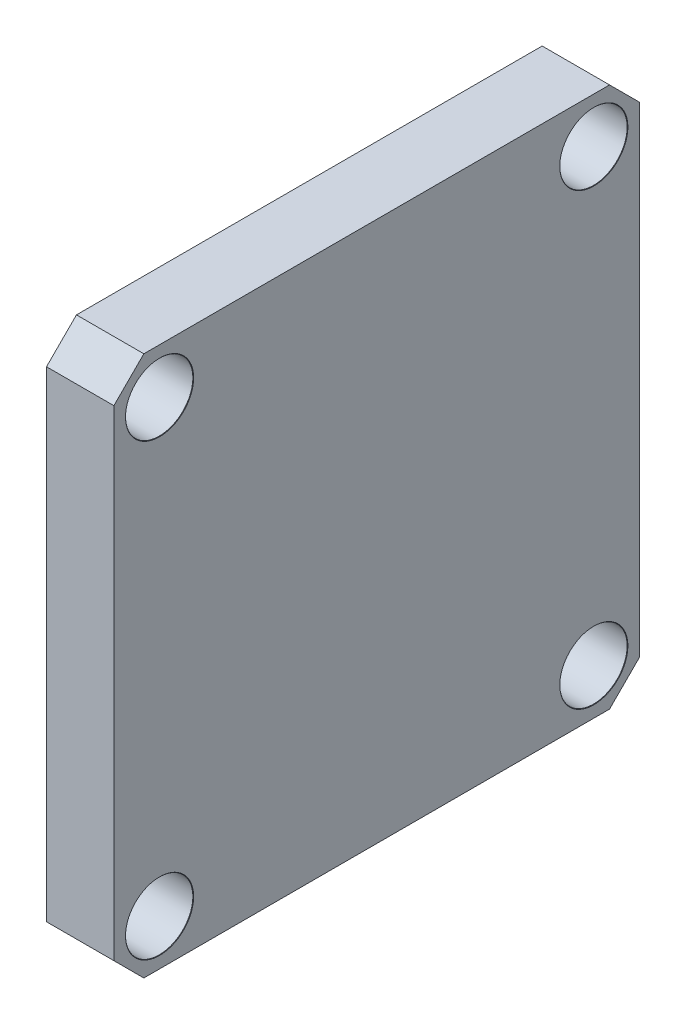
ISO-10303-21;
HEADER;
FILE_DESCRIPTION(('STEP AP214'),'2;1');
FILE_NAME('part.step','',(''),(''),'','','');
FILE_SCHEMA(('AUTOMOTIVE_DESIGN { 1 0 10303 214 1 1 1 1 }'));
ENDSEC;
DATA;
#1=APPLICATION_CONTEXT('core data for automotive mechanical design processes');
#2=APPLICATION_PROTOCOL_DEFINITION('international standard','automotive_design',2000,#1);
#3=PRODUCT_CONTEXT('',#1,'mechanical');
#4=PRODUCT('Part','Part','',(#3));
#5=PRODUCT_RELATED_PRODUCT_CATEGORY('part','',(#4));
#6=PRODUCT_DEFINITION_FORMATION('','',#4);
#7=PRODUCT_DEFINITION_CONTEXT('part definition',#1,'design');
#8=PRODUCT_DEFINITION('design','',#6,#7);
#9=PRODUCT_DEFINITION_SHAPE('','',#8);
#10=(LENGTH_UNIT() NAMED_UNIT(*) SI_UNIT(.MILLI.,.METRE.));
#11=(NAMED_UNIT(*) PLANE_ANGLE_UNIT() SI_UNIT($,.RADIAN.));
#12=(NAMED_UNIT(*) SI_UNIT($,.STERADIAN.) SOLID_ANGLE_UNIT());
#13=UNCERTAINTY_MEASURE_WITH_UNIT(LENGTH_MEASURE(1.E-05),#10,'distance_accuracy_value','');
#14=(GEOMETRIC_REPRESENTATION_CONTEXT(3) GLOBAL_UNCERTAINTY_ASSIGNED_CONTEXT((#13)) GLOBAL_UNIT_ASSIGNED_CONTEXT((#10,
#11,#12)) REPRESENTATION_CONTEXT('',''));
#15=CARTESIAN_POINT('',(0.,0.,0.));
#16=DIRECTION('',(0.,0.,1.));
#17=DIRECTION('',(1.,0.,0.));
#18=AXIS2_PLACEMENT_3D('',#15,#16,#17);
#19=CARTESIAN_POINT('',(4.5,-18.05,-17.55));
#20=DIRECTION('',(0.,0.,1.));
#21=DIRECTION('',(1.,0.,0.));
#22=AXIS2_PLACEMENT_3D('',#19,#20,#21);
#23=PLANE('',#22);
#24=DIRECTION('',(0.,1.,0.));
#25=VECTOR('',#24,1.);
#26=CARTESIAN_POINT('',(4.5,-18.05,-17.55));
#27=LINE('',#26,#25);
#28=CARTESIAN_POINT('',(4.5,-16.05,-17.55));
#29=VERTEX_POINT('',#28);
#30=CARTESIAN_POINT('',(4.5,16.05,-17.55));
#31=VERTEX_POINT('',#30);
#32=EDGE_CURVE('E117',#29,#31,#27,.T.);
#33=ORIENTED_EDGE('',*,*,#32,.F.);
#34=DIRECTION('',(-1.,0.,0.));
#35=VECTOR('',#34,1.);
#36=CARTESIAN_POINT('',(4.5,-16.05,-17.55));
#37=LINE('',#36,#35);
#38=CARTESIAN_POINT('',(0.,-16.05,-17.55));
#39=VERTEX_POINT('',#38);
#40=EDGE_CURVE('E102',#29,#39,#37,.T.);
#41=ORIENTED_EDGE('',*,*,#40,.T.);
#42=DIRECTION('',(0.,1.,0.));
#43=VECTOR('',#42,1.);
#44=CARTESIAN_POINT('',(0.,-18.05,-17.55));
#45=LINE('',#44,#43);
#46=CARTESIAN_POINT('',(0.,16.05,-17.55));
#47=VERTEX_POINT('',#46);
#48=EDGE_CURVE('E114',#39,#47,#45,.T.);
#49=ORIENTED_EDGE('',*,*,#48,.T.);
#50=DIRECTION('',(1.,0.,0.));
#51=VECTOR('',#50,1.);
#52=CARTESIAN_POINT('',(4.5,16.05,-17.55));
#53=LINE('',#52,#51);
#54=EDGE_CURVE('E119',#47,#31,#53,.T.);
#55=ORIENTED_EDGE('',*,*,#54,.T.);
#56=EDGE_LOOP('',(#33,#41,#49,#55));
#57=FACE_BOUND('',#56,.T.);
#58=ADVANCED_FACE('F33',(#57),#23,.F.);
#59=CARTESIAN_POINT('',(4.5,18.05,17.55));
#60=DIRECTION('',(0.,-1.,0.));
#61=DIRECTION('',(0.,0.,-1.));
#62=AXIS2_PLACEMENT_3D('',#59,#60,#61);
#63=PLANE('',#62);
#64=DIRECTION('',(0.,0.,1.));
#65=VECTOR('',#64,1.);
#66=CARTESIAN_POINT('',(4.5,18.05,17.55));
#67=LINE('',#66,#65);
#68=CARTESIAN_POINT('',(4.5,18.05,-15.55));
#69=VERTEX_POINT('',#68);
#70=CARTESIAN_POINT('',(4.5,18.05,15.55));
#71=VERTEX_POINT('',#70);
#72=EDGE_CURVE('E172',#69,#71,#67,.T.);
#73=ORIENTED_EDGE('',*,*,#72,.F.);
#74=DIRECTION('',(-1.,0.,0.));
#75=VECTOR('',#74,1.);
#76=CARTESIAN_POINT('',(4.5,18.05,-15.55));
#77=LINE('',#76,#75);
#78=CARTESIAN_POINT('',(0.,18.05,-15.55));
#79=VERTEX_POINT('',#78);
#80=EDGE_CURVE('E156',#69,#79,#77,.T.);
#81=ORIENTED_EDGE('',*,*,#80,.T.);
#82=DIRECTION('',(0.,0.,1.));
#83=VECTOR('',#82,1.);
#84=CARTESIAN_POINT('',(0.,18.05,17.55));
#85=LINE('',#84,#83);
#86=CARTESIAN_POINT('',(0.,18.05,15.55));
#87=VERTEX_POINT('',#86);
#88=EDGE_CURVE('E123',#79,#87,#85,.T.);
#89=ORIENTED_EDGE('',*,*,#88,.T.);
#90=DIRECTION('',(1.,0.,0.));
#91=VECTOR('',#90,1.);
#92=CARTESIAN_POINT('',(4.5,18.05,15.55));
#93=LINE('',#92,#91);
#94=EDGE_CURVE('E154',#87,#71,#93,.T.);
#95=ORIENTED_EDGE('',*,*,#94,.T.);
#96=EDGE_LOOP('',(#73,#81,#89,#95));
#97=FACE_BOUND('',#96,.T.);
#98=ADVANCED_FACE('F238',(#97),#63,.F.);
#99=CARTESIAN_POINT('',(4.5,-18.05,17.55));
#100=DIRECTION('',(0.,0.,-1.));
#101=DIRECTION('',(-1.,0.,0.));
#102=AXIS2_PLACEMENT_3D('',#99,#100,#101);
#103=PLANE('',#102);
#104=DIRECTION('',(0.,-1.,0.));
#105=VECTOR('',#104,1.);
#106=CARTESIAN_POINT('',(0.,-18.05,17.55));
#107=LINE('',#106,#105);
#108=CARTESIAN_POINT('',(0.,16.05,17.55));
#109=VERTEX_POINT('',#108);
#110=CARTESIAN_POINT('',(0.,-16.05,17.55));
#111=VERTEX_POINT('',#110);
#112=EDGE_CURVE('E127',#109,#111,#107,.T.);
#113=ORIENTED_EDGE('',*,*,#112,.T.);
#114=DIRECTION('',(1.,0.,0.));
#115=VECTOR('',#114,1.);
#116=CARTESIAN_POINT('',(4.5,-16.05,17.55));
#117=LINE('',#116,#115);
#118=CARTESIAN_POINT('',(4.5,-16.05,17.55));
#119=VERTEX_POINT('',#118);
#120=EDGE_CURVE('E11',#111,#119,#117,.T.);
#121=ORIENTED_EDGE('',*,*,#120,.T.);
#122=DIRECTION('',(0.,-1.,0.));
#123=VECTOR('',#122,1.);
#124=CARTESIAN_POINT('',(4.5,-18.05,17.55));
#125=LINE('',#124,#123);
#126=CARTESIAN_POINT('',(4.5,16.05,17.55));
#127=VERTEX_POINT('',#126);
#128=EDGE_CURVE('E162',#127,#119,#125,.T.);
#129=ORIENTED_EDGE('',*,*,#128,.F.);
#130=DIRECTION('',(-1.,0.,0.));
#131=VECTOR('',#130,1.);
#132=CARTESIAN_POINT('',(4.5,16.05,17.55));
#133=LINE('',#132,#131);
#134=EDGE_CURVE('E41',#127,#109,#133,.T.);
#135=ORIENTED_EDGE('',*,*,#134,.T.);
#136=EDGE_LOOP('',(#113,#121,#129,#135));
#137=FACE_BOUND('',#136,.T.);
#138=ADVANCED_FACE('F161',(#137),#103,.F.);
#139=CARTESIAN_POINT('',(4.5,-18.05,17.55));
#140=DIRECTION('',(0.,1.,0.));
#141=DIRECTION('',(0.,0.,1.));
#142=AXIS2_PLACEMENT_3D('',#139,#140,#141);
#143=PLANE('',#142);
#144=DIRECTION('',(0.,0.,-1.));
#145=VECTOR('',#144,1.);
#146=CARTESIAN_POINT('',(0.,-18.05,17.55));
#147=LINE('',#146,#145);
#148=CARTESIAN_POINT('',(0.,-18.05,15.55));
#149=VERTEX_POINT('',#148);
#150=CARTESIAN_POINT('',(0.,-18.05,-15.55));
#151=VERTEX_POINT('',#150);
#152=EDGE_CURVE('E137',#149,#151,#147,.T.);
#153=ORIENTED_EDGE('',*,*,#152,.T.);
#154=DIRECTION('',(1.,0.,0.));
#155=VECTOR('',#154,1.);
#156=CARTESIAN_POINT('',(4.5,-18.05,-15.55));
#157=LINE('',#156,#155);
#158=CARTESIAN_POINT('',(4.5,-18.05,-15.55));
#159=VERTEX_POINT('',#158);
#160=EDGE_CURVE('E103',#151,#159,#157,.T.);
#161=ORIENTED_EDGE('',*,*,#160,.T.);
#162=DIRECTION('',(0.,0.,-1.));
#163=VECTOR('',#162,1.);
#164=CARTESIAN_POINT('',(4.5,-18.05,17.55));
#165=LINE('',#164,#163);
#166=CARTESIAN_POINT('',(4.5,-18.05,15.55));
#167=VERTEX_POINT('',#166);
#168=EDGE_CURVE('E133',#167,#159,#165,.T.);
#169=ORIENTED_EDGE('',*,*,#168,.F.);
#170=DIRECTION('',(-1.,0.,0.));
#171=VECTOR('',#170,1.);
#172=CARTESIAN_POINT('',(4.5,-18.05,15.55));
#173=LINE('',#172,#171);
#174=EDGE_CURVE('E108',#167,#149,#173,.T.);
#175=ORIENTED_EDGE('',*,*,#174,.T.);
#176=EDGE_LOOP('',(#153,#161,#169,#175));
#177=FACE_BOUND('',#176,.T.);
#178=ADVANCED_FACE('F170',(#177),#143,.F.);
#179=CARTESIAN_POINT('',(4.5,0.,0.));
#180=DIRECTION('',(-1.,0.,0.));
#181=DIRECTION('',(0.,0.,1.));
#182=AXIS2_PLACEMENT_3D('',#179,#180,#181);
#183=PLANE('',#182);
#184=CARTESIAN_POINT('',(4.5,15.,-14.5));
#185=DIRECTION('',(1.,0.,0.));
#186=DIRECTION('',(0.,0.,-1.));
#187=AXIS2_PLACEMENT_3D('',#184,#185,#186);
#188=CIRCLE('',#187,2.275);
#189=CARTESIAN_POINT('',(4.5,15.,-16.775));
#190=VERTEX_POINT('',#189);
#191=EDGE_CURVE('E205',#190,#190,#188,.T.);
#192=ORIENTED_EDGE('',*,*,#191,.F.);
#193=EDGE_LOOP('',(#192));
#194=FACE_BOUND('',#193,.T.);
#195=CARTESIAN_POINT('',(4.5,15.,14.5));
#196=DIRECTION('',(1.,0.,0.));
#197=DIRECTION('',(0.,0.,-1.));
#198=AXIS2_PLACEMENT_3D('',#195,#196,#197);
#199=CIRCLE('',#198,2.275);
#200=CARTESIAN_POINT('',(4.5,15.,12.225));
#201=VERTEX_POINT('',#200);
#202=EDGE_CURVE('E196',#201,#201,#199,.T.);
#203=ORIENTED_EDGE('',*,*,#202,.F.);
#204=EDGE_LOOP('',(#203));
#205=FACE_BOUND('',#204,.T.);
#206=CARTESIAN_POINT('',(4.5,-15.,14.5));
#207=DIRECTION('',(1.,0.,0.));
#208=DIRECTION('',(0.,0.,-1.));
#209=AXIS2_PLACEMENT_3D('',#206,#207,#208);
#210=CIRCLE('',#209,2.275);
#211=CARTESIAN_POINT('',(4.5,-15.,12.225));
#212=VERTEX_POINT('',#211);
#213=EDGE_CURVE('E187',#212,#212,#210,.T.);
#214=ORIENTED_EDGE('',*,*,#213,.F.);
#215=EDGE_LOOP('',(#214));
#216=FACE_BOUND('',#215,.T.);
#217=CARTESIAN_POINT('',(4.5,-15.,-14.5));
#218=DIRECTION('',(1.,0.,0.));
#219=DIRECTION('',(0.,0.,-1.));
#220=AXIS2_PLACEMENT_3D('',#217,#218,#219);
#221=CIRCLE('',#220,2.275);
#222=CARTESIAN_POINT('',(4.5,-15.,-16.775));
#223=VERTEX_POINT('',#222);
#224=EDGE_CURVE('E178',#223,#223,#221,.T.);
#225=ORIENTED_EDGE('',*,*,#224,.F.);
#226=EDGE_LOOP('',(#225));
#227=FACE_BOUND('',#226,.T.);
#228=ORIENTED_EDGE('',*,*,#168,.T.);
#229=DIRECTION('',(0.,-0.707106781186546,0.707106781186549));
#230=VECTOR('',#229,1.);
#231=CARTESIAN_POINT('',(4.5,-16.05,-17.55));
#232=LINE('',#231,#230);
#233=EDGE_CURVE('E152',#159,#29,#232,.F.);
#234=ORIENTED_EDGE('',*,*,#233,.T.);
#235=ORIENTED_EDGE('',*,*,#32,.T.);
#236=DIRECTION('',(0.,-0.707106781186549,-0.707106781186546));
#237=VECTOR('',#236,1.);
#238=CARTESIAN_POINT('',(4.5,18.05,-15.55));
#239=LINE('',#238,#237);
#240=EDGE_CURVE('E150',#31,#69,#239,.F.);
#241=ORIENTED_EDGE('',*,*,#240,.T.);
#242=ORIENTED_EDGE('',*,*,#72,.T.);
#243=DIRECTION('',(0.,0.707106781186546,-0.707106781186549));
#244=VECTOR('',#243,1.);
#245=CARTESIAN_POINT('',(4.5,16.05,17.55));
#246=LINE('',#245,#244);
#247=EDGE_CURVE('E53',#71,#127,#246,.F.);
#248=ORIENTED_EDGE('',*,*,#247,.T.);
#249=ORIENTED_EDGE('',*,*,#128,.T.);
#250=DIRECTION('',(0.,0.707106781186549,0.707106781186546));
#251=VECTOR('',#250,1.);
#252=CARTESIAN_POINT('',(4.5,-18.05,15.55));
#253=LINE('',#252,#251);
#254=EDGE_CURVE('E148',#119,#167,#253,.F.);
#255=ORIENTED_EDGE('',*,*,#254,.T.);
#256=EDGE_LOOP('',(#228,#234,#235,#241,#242,#248,#249,#255));
#257=FACE_BOUND('',#256,.T.);
#258=ADVANCED_FACE('F211',(#194,#205,#216,#227,#257),#183,.F.);
#259=CARTESIAN_POINT('',(0.,0.,0.));
#260=DIRECTION('',(-1.,0.,0.));
#261=DIRECTION('',(0.,0.,1.));
#262=AXIS2_PLACEMENT_3D('',#259,#260,#261);
#263=PLANE('',#262);
#264=CARTESIAN_POINT('',(0.,15.,-14.5));
#265=DIRECTION('',(1.,0.,0.));
#266=DIRECTION('',(0.,0.,-1.));
#267=AXIS2_PLACEMENT_3D('',#264,#265,#266);
#268=CIRCLE('',#267,2.25);
#269=CARTESIAN_POINT('',(0.,15.,-16.75));
#270=VERTEX_POINT('',#269);
#271=EDGE_CURVE('E199',#270,#270,#268,.T.);
#272=ORIENTED_EDGE('',*,*,#271,.T.);
#273=EDGE_LOOP('',(#272));
#274=FACE_BOUND('',#273,.T.);
#275=CARTESIAN_POINT('',(0.,15.,14.5));
#276=DIRECTION('',(1.,0.,0.));
#277=DIRECTION('',(0.,0.,-1.));
#278=AXIS2_PLACEMENT_3D('',#275,#276,#277);
#279=CIRCLE('',#278,2.25);
#280=CARTESIAN_POINT('',(0.,15.,12.25));
#281=VERTEX_POINT('',#280);
#282=EDGE_CURVE('E190',#281,#281,#279,.T.);
#283=ORIENTED_EDGE('',*,*,#282,.T.);
#284=EDGE_LOOP('',(#283));
#285=FACE_BOUND('',#284,.T.);
#286=CARTESIAN_POINT('',(0.,-15.,14.5));
#287=DIRECTION('',(1.,0.,0.));
#288=DIRECTION('',(0.,0.,-1.));
#289=AXIS2_PLACEMENT_3D('',#286,#287,#288);
#290=CIRCLE('',#289,2.25);
#291=CARTESIAN_POINT('',(0.,-15.,12.25));
#292=VERTEX_POINT('',#291);
#293=EDGE_CURVE('E181',#292,#292,#290,.T.);
#294=ORIENTED_EDGE('',*,*,#293,.T.);
#295=EDGE_LOOP('',(#294));
#296=FACE_BOUND('',#295,.T.);
#297=CARTESIAN_POINT('',(0.,-15.,-14.5));
#298=DIRECTION('',(1.,0.,0.));
#299=DIRECTION('',(0.,0.,-1.));
#300=AXIS2_PLACEMENT_3D('',#297,#298,#299);
#301=CIRCLE('',#300,2.25);
#302=CARTESIAN_POINT('',(0.,-15.,-16.75));
#303=VERTEX_POINT('',#302);
#304=EDGE_CURVE('E124',#303,#303,#301,.T.);
#305=ORIENTED_EDGE('',*,*,#304,.T.);
#306=EDGE_LOOP('',(#305));
#307=FACE_BOUND('',#306,.T.);
#308=ORIENTED_EDGE('',*,*,#48,.F.);
#309=DIRECTION('',(0.,0.707106781186546,-0.707106781186549));
#310=VECTOR('',#309,1.);
#311=CARTESIAN_POINT('',(0.,-16.8,-16.8));
#312=LINE('',#311,#310);
#313=EDGE_CURVE('E98',#39,#151,#312,.F.);
#314=ORIENTED_EDGE('',*,*,#313,.T.);
#315=ORIENTED_EDGE('',*,*,#152,.F.);
#316=DIRECTION('',(0.,-0.707106781186549,-0.707106781186546));
#317=VECTOR('',#316,1.);
#318=CARTESIAN_POINT('',(0.,-16.8,16.8));
#319=LINE('',#318,#317);
#320=EDGE_CURVE('E141',#149,#111,#319,.F.);
#321=ORIENTED_EDGE('',*,*,#320,.T.);
#322=ORIENTED_EDGE('',*,*,#112,.F.);
#323=DIRECTION('',(0.,-0.707106781186546,0.707106781186549));
#324=VECTOR('',#323,1.);
#325=CARTESIAN_POINT('',(0.,16.8,16.8));
#326=LINE('',#325,#324);
#327=EDGE_CURVE('E118',#109,#87,#326,.F.);
#328=ORIENTED_EDGE('',*,*,#327,.T.);
#329=ORIENTED_EDGE('',*,*,#88,.F.);
#330=DIRECTION('',(0.,0.707106781186549,0.707106781186546));
#331=VECTOR('',#330,1.);
#332=CARTESIAN_POINT('',(0.,16.8,-16.8));
#333=LINE('',#332,#331);
#334=EDGE_CURVE('E109',#79,#47,#333,.F.);
#335=ORIENTED_EDGE('',*,*,#334,.T.);
#336=EDGE_LOOP('',(#308,#314,#315,#321,#322,#328,#329,#335));
#337=FACE_BOUND('',#336,.T.);
#338=ADVANCED_FACE('F121',(#274,#285,#296,#307,#337),#263,.T.);
#339=CARTESIAN_POINT('',(4.5,-16.05,-17.55));
#340=DIRECTION('',(0.,0.707106781186549,0.707106781186546));
#341=DIRECTION('',(-1.,0.,0.));
#342=AXIS2_PLACEMENT_3D('',#339,#340,#341);
#343=PLANE('',#342);
#344=ORIENTED_EDGE('',*,*,#233,.F.);
#345=ORIENTED_EDGE('',*,*,#160,.F.);
#346=ORIENTED_EDGE('',*,*,#313,.F.);
#347=ORIENTED_EDGE('',*,*,#40,.F.);
#348=EDGE_LOOP('',(#344,#345,#346,#347));
#349=FACE_BOUND('',#348,.T.);
#350=ADVANCED_FACE('F101',(#349),#343,.F.);
#351=CARTESIAN_POINT('',(4.5,18.05,-15.55));
#352=DIRECTION('',(0.,-0.707106781186546,0.707106781186549));
#353=DIRECTION('',(-1.,0.,0.));
#354=AXIS2_PLACEMENT_3D('',#351,#352,#353);
#355=PLANE('',#354);
#356=ORIENTED_EDGE('',*,*,#240,.F.);
#357=ORIENTED_EDGE('',*,*,#54,.F.);
#358=ORIENTED_EDGE('',*,*,#334,.F.);
#359=ORIENTED_EDGE('',*,*,#80,.F.);
#360=EDGE_LOOP('',(#356,#357,#358,#359));
#361=FACE_BOUND('',#360,.T.);
#362=ADVANCED_FACE('F249',(#361),#355,.F.);
#363=CARTESIAN_POINT('',(4.5,-18.05,15.55));
#364=DIRECTION('',(0.,0.707106781186546,-0.707106781186549));
#365=DIRECTION('',(-1.,0.,0.));
#366=AXIS2_PLACEMENT_3D('',#363,#364,#365);
#367=PLANE('',#366);
#368=ORIENTED_EDGE('',*,*,#254,.F.);
#369=ORIENTED_EDGE('',*,*,#120,.F.);
#370=ORIENTED_EDGE('',*,*,#320,.F.);
#371=ORIENTED_EDGE('',*,*,#174,.F.);
#372=EDGE_LOOP('',(#368,#369,#370,#371));
#373=FACE_BOUND('',#372,.T.);
#374=ADVANCED_FACE('F167',(#373),#367,.F.);
#375=CARTESIAN_POINT('',(4.5,16.05,17.55));
#376=DIRECTION('',(0.,-0.707106781186549,-0.707106781186546));
#377=DIRECTION('',(-1.,0.,0.));
#378=AXIS2_PLACEMENT_3D('',#375,#376,#377);
#379=PLANE('',#378);
#380=ORIENTED_EDGE('',*,*,#247,.F.);
#381=ORIENTED_EDGE('',*,*,#94,.F.);
#382=ORIENTED_EDGE('',*,*,#327,.F.);
#383=ORIENTED_EDGE('',*,*,#134,.F.);
#384=EDGE_LOOP('',(#380,#381,#382,#383));
#385=FACE_BOUND('',#384,.T.);
#386=ADVANCED_FACE('F35',(#385),#379,.F.);
#387=CARTESIAN_POINT('',(4.5,-15.,-14.5));
#388=DIRECTION('',(1.,0.,0.));
#389=DIRECTION('',(0.,0.,-1.));
#390=AXIS2_PLACEMENT_3D('',#387,#388,#389);
#391=CYLINDRICAL_SURFACE('',#390,2.25);
#392=ORIENTED_EDGE('',*,*,#304,.F.);
#393=EDGE_LOOP('',(#392));
#394=FACE_BOUND('',#393,.T.);
#395=CARTESIAN_POINT('',(4.475,-15.,-14.5));
#396=DIRECTION('',(1.,0.,0.));
#397=DIRECTION('',(0.,0.,-1.));
#398=AXIS2_PLACEMENT_3D('',#395,#396,#397);
#399=CIRCLE('',#398,2.25);
#400=CARTESIAN_POINT('',(4.475,-15.,-16.75));
#401=VERTEX_POINT('',#400);
#402=EDGE_CURVE('E130',#401,#401,#399,.T.);
#403=ORIENTED_EDGE('',*,*,#402,.T.);
#404=EDGE_LOOP('',(#403));
#405=FACE_BOUND('',#404,.T.);
#406=ADVANCED_FACE('F224',(#394,#405),#391,.F.);
#407=CARTESIAN_POINT('',(4.5,-15.,-14.5));
#408=DIRECTION('',(1.,0.,0.));
#409=DIRECTION('',(0.,0.,-1.));
#410=AXIS2_PLACEMENT_3D('',#407,#408,#409);
#411=CONICAL_SURFACE('',#410,2.275,0.785398163397414);
#412=ORIENTED_EDGE('',*,*,#402,.F.);
#413=EDGE_LOOP('',(#412));
#414=FACE_BOUND('',#413,.T.);
#415=ORIENTED_EDGE('',*,*,#224,.T.);
#416=EDGE_LOOP('',(#415));
#417=FACE_BOUND('',#416,.T.);
#418=ADVANCED_FACE('F221',(#414,#417),#411,.F.);
#419=CARTESIAN_POINT('',(4.5,-15.,14.5));
#420=DIRECTION('',(1.,0.,0.));
#421=DIRECTION('',(0.,0.,-1.));
#422=AXIS2_PLACEMENT_3D('',#419,#420,#421);
#423=CYLINDRICAL_SURFACE('',#422,2.25);
#424=ORIENTED_EDGE('',*,*,#293,.F.);
#425=EDGE_LOOP('',(#424));
#426=FACE_BOUND('',#425,.T.);
#427=CARTESIAN_POINT('',(4.475,-15.,14.5));
#428=DIRECTION('',(1.,0.,0.));
#429=DIRECTION('',(0.,0.,-1.));
#430=AXIS2_PLACEMENT_3D('',#427,#428,#429);
#431=CIRCLE('',#430,2.25);
#432=CARTESIAN_POINT('',(4.475,-15.,12.25));
#433=VERTEX_POINT('',#432);
#434=EDGE_CURVE('E184',#433,#433,#431,.T.);
#435=ORIENTED_EDGE('',*,*,#434,.T.);
#436=EDGE_LOOP('',(#435));
#437=FACE_BOUND('',#436,.T.);
#438=ADVANCED_FACE('F223',(#426,#437),#423,.F.);
#439=CARTESIAN_POINT('',(4.5,-15.,14.5));
#440=DIRECTION('',(1.,0.,0.));
#441=DIRECTION('',(0.,0.,-1.));
#442=AXIS2_PLACEMENT_3D('',#439,#440,#441);
#443=CONICAL_SURFACE('',#442,2.275,0.785398163397414);
#444=ORIENTED_EDGE('',*,*,#434,.F.);
#445=EDGE_LOOP('',(#444));
#446=FACE_BOUND('',#445,.T.);
#447=ORIENTED_EDGE('',*,*,#213,.T.);
#448=EDGE_LOOP('',(#447));
#449=FACE_BOUND('',#448,.T.);
#450=ADVANCED_FACE('F231',(#446,#449),#443,.F.);
#451=CARTESIAN_POINT('',(4.5,15.,14.5));
#452=DIRECTION('',(1.,0.,0.));
#453=DIRECTION('',(0.,0.,-1.));
#454=AXIS2_PLACEMENT_3D('',#451,#452,#453);
#455=CYLINDRICAL_SURFACE('',#454,2.25);
#456=ORIENTED_EDGE('',*,*,#282,.F.);
#457=EDGE_LOOP('',(#456));
#458=FACE_BOUND('',#457,.T.);
#459=CARTESIAN_POINT('',(4.475,15.,14.5));
#460=DIRECTION('',(1.,0.,0.));
#461=DIRECTION('',(0.,0.,-1.));
#462=AXIS2_PLACEMENT_3D('',#459,#460,#461);
#463=CIRCLE('',#462,2.25);
#464=CARTESIAN_POINT('',(4.475,15.,12.25));
#465=VERTEX_POINT('',#464);
#466=EDGE_CURVE('E193',#465,#465,#463,.T.);
#467=ORIENTED_EDGE('',*,*,#466,.T.);
#468=EDGE_LOOP('',(#467));
#469=FACE_BOUND('',#468,.T.);
#470=ADVANCED_FACE('F290',(#458,#469),#455,.F.);
#471=CARTESIAN_POINT('',(4.5,15.,14.5));
#472=DIRECTION('',(1.,0.,0.));
#473=DIRECTION('',(0.,0.,-1.));
#474=AXIS2_PLACEMENT_3D('',#471,#472,#473);
#475=CONICAL_SURFACE('',#474,2.275,0.785398163397414);
#476=ORIENTED_EDGE('',*,*,#466,.F.);
#477=EDGE_LOOP('',(#476));
#478=FACE_BOUND('',#477,.T.);
#479=ORIENTED_EDGE('',*,*,#202,.T.);
#480=EDGE_LOOP('',(#479));
#481=FACE_BOUND('',#480,.T.);
#482=ADVANCED_FACE('F300',(#478,#481),#475,.F.);
#483=CARTESIAN_POINT('',(4.5,15.,-14.5));
#484=DIRECTION('',(1.,0.,0.));
#485=DIRECTION('',(0.,0.,-1.));
#486=AXIS2_PLACEMENT_3D('',#483,#484,#485);
#487=CYLINDRICAL_SURFACE('',#486,2.25);
#488=ORIENTED_EDGE('',*,*,#271,.F.);
#489=EDGE_LOOP('',(#488));
#490=FACE_BOUND('',#489,.T.);
#491=CARTESIAN_POINT('',(4.475,15.,-14.5));
#492=DIRECTION('',(1.,0.,0.));
#493=DIRECTION('',(0.,0.,-1.));
#494=AXIS2_PLACEMENT_3D('',#491,#492,#493);
#495=CIRCLE('',#494,2.25);
#496=CARTESIAN_POINT('',(4.475,15.,-16.75));
#497=VERTEX_POINT('',#496);
#498=EDGE_CURVE('E202',#497,#497,#495,.T.);
#499=ORIENTED_EDGE('',*,*,#498,.T.);
#500=EDGE_LOOP('',(#499));
#501=FACE_BOUND('',#500,.T.);
#502=ADVANCED_FACE('F310',(#490,#501),#487,.F.);
#503=CARTESIAN_POINT('',(4.5,15.,-14.5));
#504=DIRECTION('',(1.,0.,0.));
#505=DIRECTION('',(0.,0.,-1.));
#506=AXIS2_PLACEMENT_3D('',#503,#504,#505);
#507=CONICAL_SURFACE('',#506,2.275,0.785398163397414);
#508=ORIENTED_EDGE('',*,*,#498,.F.);
#509=EDGE_LOOP('',(#508));
#510=FACE_BOUND('',#509,.T.);
#511=ORIENTED_EDGE('',*,*,#191,.T.);
#512=EDGE_LOOP('',(#511));
#513=FACE_BOUND('',#512,.T.);
#514=ADVANCED_FACE('F209',(#510,#513),#507,.F.);
#515=CLOSED_SHELL('',(#58,#98,#138,#178,#258,#338,#350,#362,#374,#386,#406,#418,#438,#450,#470,
#482,#502,#514));
#516=MANIFOLD_SOLID_BREP('B2',#515);
#517=ADVANCED_BREP_SHAPE_REPRESENTATION('',(#18,#516),#14);
#518=SHAPE_DEFINITION_REPRESENTATION(#9,#517);
ENDSEC;
END-ISO-10303-21;
